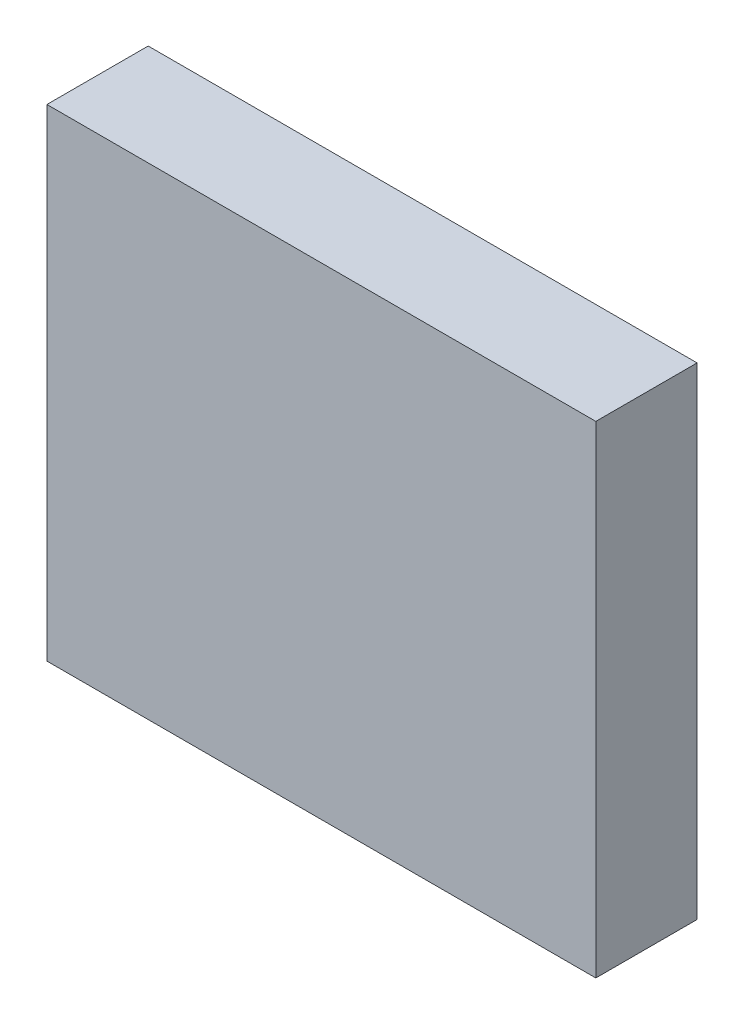
ISO-10303-21;
HEADER;
FILE_DESCRIPTION(('STEP AP214'),'2;1');
FILE_NAME('part.step','',(''),(''),'','','');
FILE_SCHEMA(('AUTOMOTIVE_DESIGN { 1 0 10303 214 1 1 1 1 }'));
ENDSEC;
DATA;
#1=APPLICATION_CONTEXT('core data for automotive mechanical design processes');
#2=APPLICATION_PROTOCOL_DEFINITION('international standard','automotive_design',2000,#1);
#3=PRODUCT_CONTEXT('',#1,'mechanical');
#4=PRODUCT('Part','Part','',(#3));
#5=PRODUCT_RELATED_PRODUCT_CATEGORY('part','',(#4));
#6=PRODUCT_DEFINITION_FORMATION('','',#4);
#7=PRODUCT_DEFINITION_CONTEXT('part definition',#1,'design');
#8=PRODUCT_DEFINITION('design','',#6,#7);
#9=PRODUCT_DEFINITION_SHAPE('','',#8);
#10=(LENGTH_UNIT() NAMED_UNIT(*) SI_UNIT(.MILLI.,.METRE.));
#11=(NAMED_UNIT(*) PLANE_ANGLE_UNIT() SI_UNIT($,.RADIAN.));
#12=(NAMED_UNIT(*) SI_UNIT($,.STERADIAN.) SOLID_ANGLE_UNIT());
#13=UNCERTAINTY_MEASURE_WITH_UNIT(LENGTH_MEASURE(1.E-05),#10,'distance_accuracy_value','');
#14=(GEOMETRIC_REPRESENTATION_CONTEXT(3) GLOBAL_UNCERTAINTY_ASSIGNED_CONTEXT((#13)) GLOBAL_UNIT_ASSIGNED_CONTEXT((#10,
#11,#12)) REPRESENTATION_CONTEXT('',''));
#15=CARTESIAN_POINT('',(0.,0.,0.));
#16=DIRECTION('',(0.,0.,1.));
#17=DIRECTION('',(1.,0.,0.));
#18=AXIS2_PLACEMENT_3D('',#15,#16,#17);
#19=CARTESIAN_POINT('',(34.417,30.226,12.7));
#20=DIRECTION('',(-1.,0.,0.));
#21=DIRECTION('',(0.,-1.,0.));
#22=AXIS2_PLACEMENT_3D('',#19,#20,#21);
#23=PLANE('',#22);
#24=DIRECTION('',(0.,1.,0.));
#25=VECTOR('',#24,1.);
#26=CARTESIAN_POINT('',(34.417,30.226,0.));
#27=LINE('',#26,#25);
#28=CARTESIAN_POINT('',(34.417,-30.226,0.));
#29=VERTEX_POINT('',#28);
#30=CARTESIAN_POINT('',(34.417,30.226,0.));
#31=VERTEX_POINT('',#30);
#32=EDGE_CURVE('E95',#29,#31,#27,.T.);
#33=ORIENTED_EDGE('',*,*,#32,.T.);
#34=DIRECTION('',(0.,0.,-1.));
#35=VECTOR('',#34,1.);
#36=CARTESIAN_POINT('',(34.417,30.226,12.7));
#37=LINE('',#36,#35);
#38=CARTESIAN_POINT('',(34.417,30.226,12.7));
#39=VERTEX_POINT('',#38);
#40=EDGE_CURVE('E11',#39,#31,#37,.T.);
#41=ORIENTED_EDGE('',*,*,#40,.F.);
#42=DIRECTION('',(0.,1.,0.));
#43=VECTOR('',#42,1.);
#44=CARTESIAN_POINT('',(34.417,30.226,12.7));
#45=LINE('',#44,#43);
#46=CARTESIAN_POINT('',(34.417,-30.226,12.7));
#47=VERTEX_POINT('',#46);
#48=EDGE_CURVE('E83',#47,#39,#45,.T.);
#49=ORIENTED_EDGE('',*,*,#48,.F.);
#50=DIRECTION('',(0.,0.,-1.));
#51=VECTOR('',#50,1.);
#52=CARTESIAN_POINT('',(34.417,-30.226,12.7));
#53=LINE('',#52,#51);
#54=EDGE_CURVE('E91',#47,#29,#53,.T.);
#55=ORIENTED_EDGE('',*,*,#54,.T.);
#56=EDGE_LOOP('',(#33,#41,#49,#55));
#57=FACE_BOUND('',#56,.T.);
#58=ADVANCED_FACE('F32',(#57),#23,.F.);
#59=CARTESIAN_POINT('',(-34.417,30.226,12.7));
#60=DIRECTION('',(0.,-1.,0.));
#61=DIRECTION('',(0.,0.,-1.));
#62=AXIS2_PLACEMENT_3D('',#59,#60,#61);
#63=PLANE('',#62);
#64=DIRECTION('',(-1.,0.,0.));
#65=VECTOR('',#64,1.);
#66=CARTESIAN_POINT('',(-34.417,30.226,0.));
#67=LINE('',#66,#65);
#68=CARTESIAN_POINT('',(-34.417,30.226,0.));
#69=VERTEX_POINT('',#68);
#70=EDGE_CURVE('E87',#31,#69,#67,.T.);
#71=ORIENTED_EDGE('',*,*,#70,.T.);
#72=DIRECTION('',(0.,0.,-1.));
#73=VECTOR('',#72,1.);
#74=CARTESIAN_POINT('',(-34.417,30.226,12.7));
#75=LINE('',#74,#73);
#76=CARTESIAN_POINT('',(-34.417,30.226,12.7));
#77=VERTEX_POINT('',#76);
#78=EDGE_CURVE('E40',#77,#69,#75,.T.);
#79=ORIENTED_EDGE('',*,*,#78,.F.);
#80=DIRECTION('',(-1.,0.,0.));
#81=VECTOR('',#80,1.);
#82=CARTESIAN_POINT('',(-34.417,30.226,12.7));
#83=LINE('',#82,#81);
#84=EDGE_CURVE('E78',#39,#77,#83,.T.);
#85=ORIENTED_EDGE('',*,*,#84,.F.);
#86=ORIENTED_EDGE('',*,*,#40,.T.);
#87=EDGE_LOOP('',(#71,#79,#85,#86));
#88=FACE_BOUND('',#87,.T.);
#89=ADVANCED_FACE('F86',(#88),#63,.F.);
#90=CARTESIAN_POINT('',(-34.417,30.226,12.7));
#91=DIRECTION('',(1.,0.,0.));
#92=DIRECTION('',(0.,1.,0.));
#93=AXIS2_PLACEMENT_3D('',#90,#91,#92);
#94=PLANE('',#93);
#95=DIRECTION('',(0.,-1.,0.));
#96=VECTOR('',#95,1.);
#97=CARTESIAN_POINT('',(-34.417,30.226,0.));
#98=LINE('',#97,#96);
#99=CARTESIAN_POINT('',(-34.417,-30.226,0.));
#100=VERTEX_POINT('',#99);
#101=EDGE_CURVE('E65',#69,#100,#98,.T.);
#102=ORIENTED_EDGE('',*,*,#101,.T.);
#103=DIRECTION('',(0.,0.,-1.));
#104=VECTOR('',#103,1.);
#105=CARTESIAN_POINT('',(-34.417,-30.226,12.7));
#106=LINE('',#105,#104);
#107=CARTESIAN_POINT('',(-34.417,-30.226,12.7));
#108=VERTEX_POINT('',#107);
#109=EDGE_CURVE('E88',#108,#100,#106,.T.);
#110=ORIENTED_EDGE('',*,*,#109,.F.);
#111=DIRECTION('',(0.,-1.,0.));
#112=VECTOR('',#111,1.);
#113=CARTESIAN_POINT('',(-34.417,30.226,12.7));
#114=LINE('',#113,#112);
#115=EDGE_CURVE('E81',#77,#108,#114,.T.);
#116=ORIENTED_EDGE('',*,*,#115,.F.);
#117=ORIENTED_EDGE('',*,*,#78,.T.);
#118=EDGE_LOOP('',(#102,#110,#116,#117));
#119=FACE_BOUND('',#118,.T.);
#120=ADVANCED_FACE('F89',(#119),#94,.F.);
#121=CARTESIAN_POINT('',(-34.417,-30.226,12.7));
#122=DIRECTION('',(0.,1.,0.));
#123=DIRECTION('',(0.,0.,1.));
#124=AXIS2_PLACEMENT_3D('',#121,#122,#123);
#125=PLANE('',#124);
#126=DIRECTION('',(1.,0.,0.));
#127=VECTOR('',#126,1.);
#128=CARTESIAN_POINT('',(-34.417,-30.226,0.));
#129=LINE('',#128,#127);
#130=EDGE_CURVE('E71',#100,#29,#129,.T.);
#131=ORIENTED_EDGE('',*,*,#130,.T.);
#132=ORIENTED_EDGE('',*,*,#54,.F.);
#133=DIRECTION('',(1.,0.,0.));
#134=VECTOR('',#133,1.);
#135=CARTESIAN_POINT('',(-34.417,-30.226,12.7));
#136=LINE('',#135,#134);
#137=EDGE_CURVE('E48',#108,#47,#136,.T.);
#138=ORIENTED_EDGE('',*,*,#137,.F.);
#139=ORIENTED_EDGE('',*,*,#109,.T.);
#140=EDGE_LOOP('',(#131,#132,#138,#139));
#141=FACE_BOUND('',#140,.T.);
#142=ADVANCED_FACE('F102',(#141),#125,.F.);
#143=CARTESIAN_POINT('',(34.417,-30.226,12.7));
#144=DIRECTION('',(0.,0.,1.));
#145=DIRECTION('',(1.,0.,0.));
#146=AXIS2_PLACEMENT_3D('',#143,#144,#145);
#147=PLANE('',#146);
#148=ORIENTED_EDGE('',*,*,#48,.T.);
#149=ORIENTED_EDGE('',*,*,#84,.T.);
#150=ORIENTED_EDGE('',*,*,#115,.T.);
#151=ORIENTED_EDGE('',*,*,#137,.T.);
#152=EDGE_LOOP('',(#148,#149,#150,#151));
#153=FACE_BOUND('',#152,.T.);
#154=ADVANCED_FACE('F79',(#153),#147,.T.);
#155=CARTESIAN_POINT('',(34.417,-30.226,0.));
#156=DIRECTION('',(0.,0.,1.));
#157=DIRECTION('',(1.,0.,0.));
#158=AXIS2_PLACEMENT_3D('',#155,#156,#157);
#159=PLANE('',#158);
#160=ORIENTED_EDGE('',*,*,#32,.F.);
#161=ORIENTED_EDGE('',*,*,#130,.F.);
#162=ORIENTED_EDGE('',*,*,#101,.F.);
#163=ORIENTED_EDGE('',*,*,#70,.F.);
#164=EDGE_LOOP('',(#160,#161,#162,#163));
#165=FACE_BOUND('',#164,.T.);
#166=ADVANCED_FACE('F105',(#165),#159,.F.);
#167=CLOSED_SHELL('',(#58,#89,#120,#142,#154,#166));
#168=MANIFOLD_SOLID_BREP('B2',#167);
#169=ADVANCED_BREP_SHAPE_REPRESENTATION('',(#18,#168),#14);
#170=SHAPE_DEFINITION_REPRESENTATION(#9,#169);
ENDSEC;
END-ISO-10303-21;
